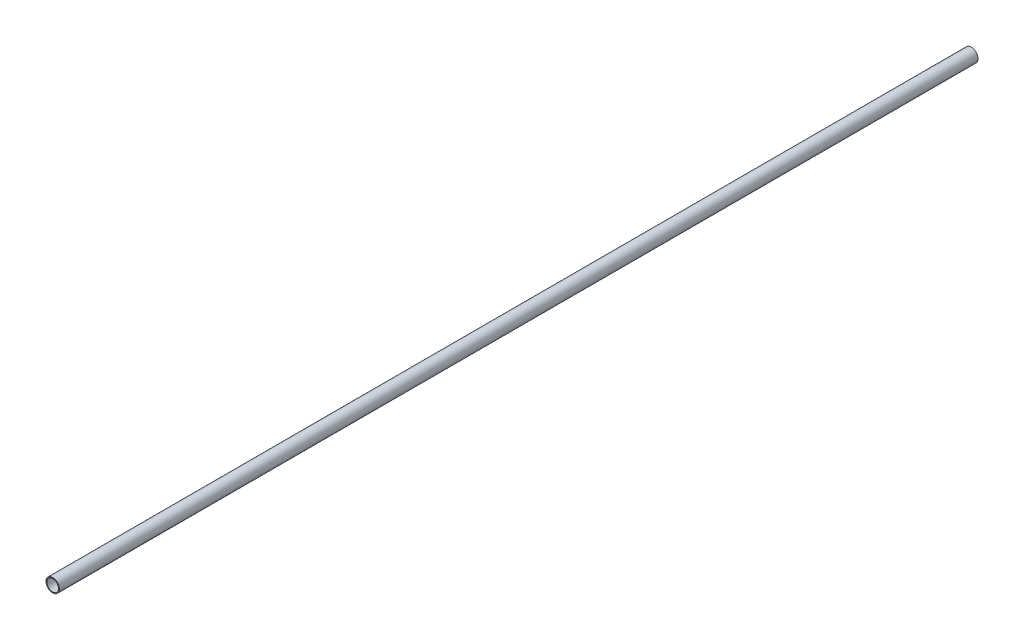
ISO-10303-21;
HEADER;
FILE_DESCRIPTION(('STEP AP214'),'2;1');
FILE_NAME('part.step','',(''),(''),'','','');
FILE_SCHEMA(('AUTOMOTIVE_DESIGN { 1 0 10303 214 1 1 1 1 }'));
ENDSEC;
DATA;
#1=APPLICATION_CONTEXT('core data for automotive mechanical design processes');
#2=APPLICATION_PROTOCOL_DEFINITION('international standard','automotive_design',2000,#1);
#3=PRODUCT_CONTEXT('',#1,'mechanical');
#4=PRODUCT('Part','Part','',(#3));
#5=PRODUCT_RELATED_PRODUCT_CATEGORY('part','',(#4));
#6=PRODUCT_DEFINITION_FORMATION('','',#4);
#7=PRODUCT_DEFINITION_CONTEXT('part definition',#1,'design');
#8=PRODUCT_DEFINITION('design','',#6,#7);
#9=PRODUCT_DEFINITION_SHAPE('','',#8);
#10=(LENGTH_UNIT() NAMED_UNIT(*) SI_UNIT(.MILLI.,.METRE.));
#11=(NAMED_UNIT(*) PLANE_ANGLE_UNIT() SI_UNIT($,.RADIAN.));
#12=(NAMED_UNIT(*) SI_UNIT($,.STERADIAN.) SOLID_ANGLE_UNIT());
#13=UNCERTAINTY_MEASURE_WITH_UNIT(LENGTH_MEASURE(1.E-05),#10,'distance_accuracy_value','');
#14=(GEOMETRIC_REPRESENTATION_CONTEXT(3) GLOBAL_UNCERTAINTY_ASSIGNED_CONTEXT((#13)) GLOBAL_UNIT_ASSIGNED_CONTEXT((#10,
#11,#12)) REPRESENTATION_CONTEXT('',''));
#15=CARTESIAN_POINT('',(0.,0.,0.));
#16=DIRECTION('',(0.,0.,1.));
#17=DIRECTION('',(1.,0.,0.));
#18=AXIS2_PLACEMENT_3D('',#15,#16,#17);
#19=CARTESIAN_POINT('',(0.,0.,550.));
#20=DIRECTION('',(0.,0.,1.));
#21=DIRECTION('',(1.,0.,0.));
#22=AXIS2_PLACEMENT_3D('',#19,#20,#21);
#23=PLANE('',#22);
#24=CARTESIAN_POINT('',(0.,0.,550.));
#25=DIRECTION('',(0.,0.,1.));
#26=DIRECTION('',(1.,0.,0.));
#27=AXIS2_PLACEMENT_3D('',#24,#25,#26);
#28=CIRCLE('',#27,8.);
#29=CARTESIAN_POINT('',(8.,0.,550.));
#30=VERTEX_POINT('',#29);
#31=EDGE_CURVE('E10',#30,#30,#28,.T.);
#32=ORIENTED_EDGE('',*,*,#31,.T.);
#33=EDGE_LOOP('',(#32));
#34=FACE_BOUND('',#33,.T.);
#35=CARTESIAN_POINT('',(0.,0.,550.));
#36=DIRECTION('',(0.,0.,1.));
#37=DIRECTION('',(1.,0.,0.));
#38=AXIS2_PLACEMENT_3D('',#35,#36,#37);
#39=CIRCLE('',#38,7.);
#40=CARTESIAN_POINT('',(7.,0.,550.));
#41=VERTEX_POINT('',#40);
#42=EDGE_CURVE('E42',#41,#41,#39,.T.);
#43=ORIENTED_EDGE('',*,*,#42,.F.);
#44=EDGE_LOOP('',(#43));
#45=FACE_BOUND('',#44,.T.);
#46=ADVANCED_FACE('F31',(#34,#45),#23,.T.);
#47=CARTESIAN_POINT('',(0.,0.,-550.));
#48=DIRECTION('',(0.,0.,1.));
#49=DIRECTION('',(1.,0.,0.));
#50=AXIS2_PLACEMENT_3D('',#47,#48,#49);
#51=PLANE('',#50);
#52=CARTESIAN_POINT('',(0.,0.,-550.));
#53=DIRECTION('',(0.,0.,1.));
#54=DIRECTION('',(1.,0.,0.));
#55=AXIS2_PLACEMENT_3D('',#52,#53,#54);
#56=CIRCLE('',#55,8.);
#57=CARTESIAN_POINT('',(8.,0.,-550.));
#58=VERTEX_POINT('',#57);
#59=EDGE_CURVE('E35',#58,#58,#56,.T.);
#60=ORIENTED_EDGE('',*,*,#59,.F.);
#61=EDGE_LOOP('',(#60));
#62=FACE_BOUND('',#61,.T.);
#63=CARTESIAN_POINT('',(0.,0.,-550.));
#64=DIRECTION('',(0.,0.,1.));
#65=DIRECTION('',(1.,0.,0.));
#66=AXIS2_PLACEMENT_3D('',#63,#64,#65);
#67=CIRCLE('',#66,7.);
#68=CARTESIAN_POINT('',(7.,0.,-550.));
#69=VERTEX_POINT('',#68);
#70=EDGE_CURVE('E44',#69,#69,#67,.T.);
#71=ORIENTED_EDGE('',*,*,#70,.T.);
#72=EDGE_LOOP('',(#71));
#73=FACE_BOUND('',#72,.T.);
#74=ADVANCED_FACE('F54',(#62,#73),#51,.F.);
#75=CARTESIAN_POINT('',(0.,0.,550.));
#76=DIRECTION('',(0.,0.,-1.));
#77=DIRECTION('',(-1.,0.,0.));
#78=AXIS2_PLACEMENT_3D('',#75,#76,#77);
#79=CYLINDRICAL_SURFACE('',#78,8.);
#80=ORIENTED_EDGE('',*,*,#31,.F.);
#81=EDGE_LOOP('',(#80));
#82=FACE_BOUND('',#81,.T.);
#83=ORIENTED_EDGE('',*,*,#59,.T.);
#84=EDGE_LOOP('',(#83));
#85=FACE_BOUND('',#84,.T.);
#86=ADVANCED_FACE('F33',(#82,#85),#79,.T.);
#87=CARTESIAN_POINT('',(0.,0.,550.));
#88=DIRECTION('',(0.,0.,-1.));
#89=DIRECTION('',(-1.,0.,0.));
#90=AXIS2_PLACEMENT_3D('',#87,#88,#89);
#91=CYLINDRICAL_SURFACE('',#90,7.);
#92=ORIENTED_EDGE('',*,*,#42,.T.);
#93=EDGE_LOOP('',(#92));
#94=FACE_BOUND('',#93,.T.);
#95=ORIENTED_EDGE('',*,*,#70,.F.);
#96=EDGE_LOOP('',(#95));
#97=FACE_BOUND('',#96,.T.);
#98=ADVANCED_FACE('F50',(#94,#97),#91,.F.);
#99=CLOSED_SHELL('',(#46,#74,#86,#98));
#100=MANIFOLD_SOLID_BREP('B2',#99);
#101=ADVANCED_BREP_SHAPE_REPRESENTATION('',(#18,#100),#14);
#102=SHAPE_DEFINITION_REPRESENTATION(#9,#101);
ENDSEC;
END-ISO-10303-21;
